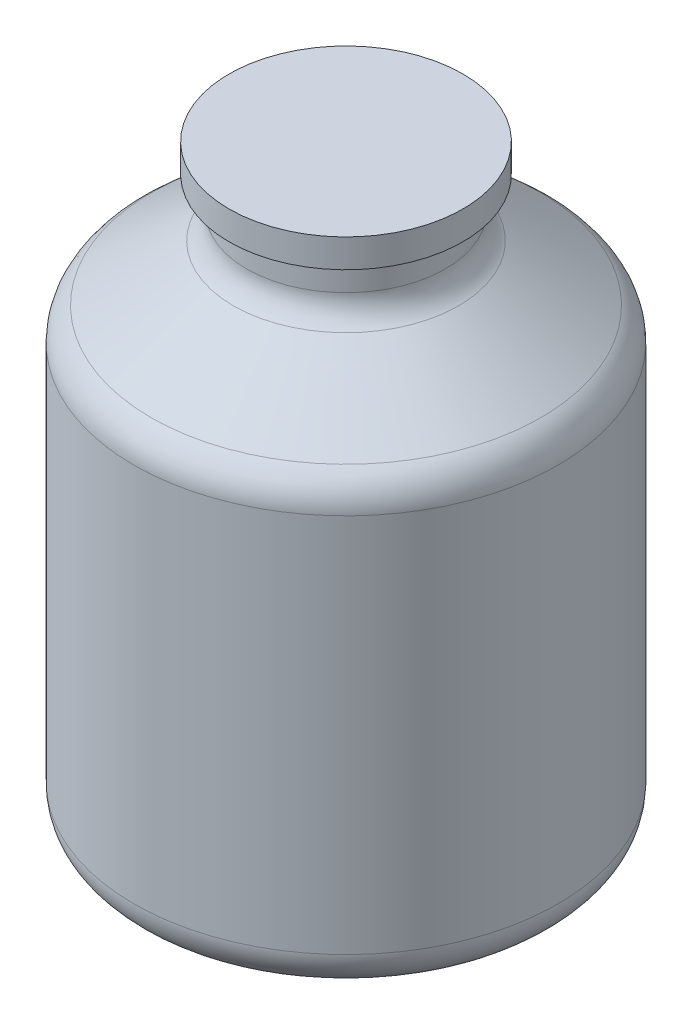
ISO-10303-21;
HEADER;
FILE_DESCRIPTION(('STEP AP214'),'2;1');
FILE_NAME('part.step','',(''),(''),'','','');
FILE_SCHEMA(('AUTOMOTIVE_DESIGN { 1 0 10303 214 1 1 1 1 }'));
ENDSEC;
DATA;
#1=APPLICATION_CONTEXT('core data for automotive mechanical design processes');
#2=APPLICATION_PROTOCOL_DEFINITION('international standard','automotive_design',2000,#1);
#3=PRODUCT_CONTEXT('',#1,'mechanical');
#4=PRODUCT('Part','Part','',(#3));
#5=PRODUCT_RELATED_PRODUCT_CATEGORY('part','',(#4));
#6=PRODUCT_DEFINITION_FORMATION('','',#4);
#7=PRODUCT_DEFINITION_CONTEXT('part definition',#1,'design');
#8=PRODUCT_DEFINITION('design','',#6,#7);
#9=PRODUCT_DEFINITION_SHAPE('','',#8);
#10=(LENGTH_UNIT() NAMED_UNIT(*) SI_UNIT(.MILLI.,.METRE.));
#11=(NAMED_UNIT(*) PLANE_ANGLE_UNIT() SI_UNIT($,.RADIAN.));
#12=(NAMED_UNIT(*) SI_UNIT($,.STERADIAN.) SOLID_ANGLE_UNIT());
#13=UNCERTAINTY_MEASURE_WITH_UNIT(LENGTH_MEASURE(1.E-05),#10,'distance_accuracy_value','');
#14=(GEOMETRIC_REPRESENTATION_CONTEXT(3) GLOBAL_UNCERTAINTY_ASSIGNED_CONTEXT((#13)) GLOBAL_UNIT_ASSIGNED_CONTEXT((#10,
#11,#12)) REPRESENTATION_CONTEXT('',''));
#15=CARTESIAN_POINT('',(0.,0.,0.));
#16=DIRECTION('',(0.,0.,1.));
#17=DIRECTION('',(1.,0.,0.));
#18=AXIS2_PLACEMENT_3D('',#15,#16,#17);
#19=CARTESIAN_POINT('',(0.,0.,0.));
#20=DIRECTION('',(0.,1.,0.));
#21=DIRECTION('',(0.,0.,1.));
#22=AXIS2_PLACEMENT_3D('',#19,#20,#21);
#23=PLANE('',#22);
#24=CARTESIAN_POINT('',(0.,0.,0.));
#25=DIRECTION('',(0.,1.,0.));
#26=DIRECTION('',(0.,0.,1.));
#27=AXIS2_PLACEMENT_3D('',#24,#25,#26);
#28=CIRCLE('',#27,55.8506106293866);
#29=CARTESIAN_POINT('',(0.,0.,55.8506106293866));
#30=VERTEX_POINT('',#29);
#31=EDGE_CURVE('E10',#30,#30,#28,.T.);
#32=ORIENTED_EDGE('',*,*,#31,.F.);
#33=EDGE_LOOP('',(#32));
#34=FACE_BOUND('',#33,.T.);
#35=ADVANCED_FACE('F32',(#34),#23,.F.);
#36=CARTESIAN_POINT('',(0.,12.7,0.));
#37=DIRECTION('',(0.,1.,0.));
#38=DIRECTION('',(0.,0.,1.));
#39=AXIS2_PLACEMENT_3D('',#36,#37,#38);
#40=TOROIDAL_SURFACE('',#39,55.8506106293866,12.7);
#41=CARTESIAN_POINT('',(0.,12.7,0.));
#42=DIRECTION('',(0.,1.,0.));
#43=DIRECTION('',(0.,0.,1.));
#44=AXIS2_PLACEMENT_3D('',#41,#42,#43);
#45=CIRCLE('',#44,68.5506106293866);
#46=CARTESIAN_POINT('',(0.,12.7,68.5506106293866));
#47=VERTEX_POINT('',#46);
#48=EDGE_CURVE('E38',#47,#47,#45,.T.);
#49=ORIENTED_EDGE('',*,*,#48,.F.);
#50=EDGE_LOOP('',(#49));
#51=FACE_BOUND('',#50,.T.);
#52=ORIENTED_EDGE('',*,*,#31,.T.);
#53=EDGE_LOOP('',(#52));
#54=FACE_BOUND('',#53,.T.);
#55=ADVANCED_FACE('F107',(#51,#54),#40,.T.);
#56=CARTESIAN_POINT('',(0.,191.88999199796,0.));
#57=DIRECTION('',(0.,1.,0.));
#58=DIRECTION('',(0.,0.,1.));
#59=AXIS2_PLACEMENT_3D('',#56,#57,#58);
#60=CYLINDRICAL_SURFACE('',#59,68.5506106293866);
#61=CARTESIAN_POINT('',(0.,135.537090780889,0.));
#62=DIRECTION('',(0.,1.,0.));
#63=DIRECTION('',(0.,0.,1.));
#64=AXIS2_PLACEMENT_3D('',#61,#62,#63);
#65=CIRCLE('',#64,68.5506106293866);
#66=CARTESIAN_POINT('',(0.,135.537090780889,68.5506106293866));
#67=VERTEX_POINT('',#66);
#68=EDGE_CURVE('E42',#67,#67,#65,.T.);
#69=ORIENTED_EDGE('',*,*,#68,.F.);
#70=EDGE_LOOP('',(#69));
#71=FACE_BOUND('',#70,.T.);
#72=ORIENTED_EDGE('',*,*,#48,.T.);
#73=EDGE_LOOP('',(#72));
#74=FACE_BOUND('',#73,.T.);
#75=ADVANCED_FACE('F102',(#71,#74),#60,.T.);
#76=CARTESIAN_POINT('',(0.,135.537090780889,0.));
#77=DIRECTION('',(0.,1.,0.));
#78=DIRECTION('',(0.,0.,1.));
#79=AXIS2_PLACEMENT_3D('',#76,#77,#78);
#80=TOROIDAL_SURFACE('',#79,55.8506106293866,12.7);
#81=CARTESIAN_POINT('',(0.,146.041145392436,0.));
#82=DIRECTION('',(0.,1.,0.));
#83=DIRECTION('',(0.,0.,1.));
#84=AXIS2_PLACEMENT_3D('',#81,#82,#83);
#85=CIRCLE('',#84,62.9888762953326);
#86=CARTESIAN_POINT('',(0.,146.041145392436,62.9888762953326));
#87=VERTEX_POINT('',#86);
#88=EDGE_CURVE('E46',#87,#87,#85,.T.);
#89=ORIENTED_EDGE('',*,*,#88,.F.);
#90=EDGE_LOOP('',(#89));
#91=FACE_BOUND('',#90,.T.);
#92=ORIENTED_EDGE('',*,*,#68,.T.);
#93=EDGE_LOOP('',(#92));
#94=FACE_BOUND('',#93,.T.);
#95=ADVANCED_FACE('F96',(#91,#94),#80,.T.);
#96=CARTESIAN_POINT('',(0.,146.041145392436,0.));
#97=DIRECTION('',(0.,-1.,0.));
#98=DIRECTION('',(0.,0.,-1.));
#99=AXIS2_PLACEMENT_3D('',#96,#97,#98);
#100=CONICAL_SURFACE('',#99,62.9888762953326,0.973912118745665);
#101=CARTESIAN_POINT('',(0.,164.092378592853,0.));
#102=DIRECTION('',(0.,1.,0.));
#103=DIRECTION('',(0.,0.,1.));
#104=AXIS2_PLACEMENT_3D('',#101,#102,#103);
#105=CIRCLE('',#104,36.4262421463226);
#106=CARTESIAN_POINT('',(0.,164.092378592853,36.4262421463226));
#107=VERTEX_POINT('',#106);
#108=EDGE_CURVE('E51',#107,#107,#105,.T.);
#109=ORIENTED_EDGE('',*,*,#108,.F.);
#110=EDGE_LOOP('',(#109));
#111=FACE_BOUND('',#110,.T.);
#112=ORIENTED_EDGE('',*,*,#88,.T.);
#113=EDGE_LOOP('',(#112));
#114=FACE_BOUND('',#113,.T.);
#115=ADVANCED_FACE('F90',(#111,#114),#100,.T.);
#116=CARTESIAN_POINT('',(0.,172.244930881121,0.));
#117=DIRECTION('',(0.,1.,0.));
#118=DIRECTION('',(0.,0.,1.));
#119=AXIS2_PLACEMENT_3D('',#116,#117,#118);
#120=TOROIDAL_SURFACE('',#119,41.9664917205388,9.85689982487104);
#121=CARTESIAN_POINT('',(0.,172.244930881121,0.));
#122=DIRECTION('',(0.,1.,0.));
#123=DIRECTION('',(0.,0.,1.));
#124=AXIS2_PLACEMENT_3D('',#121,#122,#123);
#125=CIRCLE('',#124,32.1095918956678);
#126=CARTESIAN_POINT('',(0.,172.244930881121,32.1095918956678));
#127=VERTEX_POINT('',#126);
#128=EDGE_CURVE('E54',#127,#127,#125,.T.);
#129=ORIENTED_EDGE('',*,*,#128,.F.);
#130=EDGE_LOOP('',(#129));
#131=FACE_BOUND('',#130,.T.);
#132=ORIENTED_EDGE('',*,*,#108,.T.);
#133=EDGE_LOOP('',(#132));
#134=FACE_BOUND('',#133,.T.);
#135=ADVANCED_FACE('F84',(#131,#134),#120,.F.);
#136=CARTESIAN_POINT('',(0.,191.88999199796,0.));
#137=DIRECTION('',(0.,1.,0.));
#138=DIRECTION('',(0.,0.,1.));
#139=AXIS2_PLACEMENT_3D('',#136,#137,#138);
#140=CYLINDRICAL_SURFACE('',#139,32.1095918956678);
#141=CARTESIAN_POINT('',(0.,182.693006016334,0.));
#142=DIRECTION('',(0.,1.,0.));
#143=DIRECTION('',(0.,0.,1.));
#144=AXIS2_PLACEMENT_3D('',#141,#142,#143);
#145=CIRCLE('',#144,32.1095918956678);
#146=CARTESIAN_POINT('',(0.,182.693006016334,32.1095918956678));
#147=VERTEX_POINT('',#146);
#148=EDGE_CURVE('E57',#147,#147,#145,.T.);
#149=ORIENTED_EDGE('',*,*,#148,.F.);
#150=EDGE_LOOP('',(#149));
#151=FACE_BOUND('',#150,.T.);
#152=ORIENTED_EDGE('',*,*,#128,.T.);
#153=EDGE_LOOP('',(#152));
#154=FACE_BOUND('',#153,.T.);
#155=ADVANCED_FACE('F78',(#151,#154),#140,.T.);
#156=CARTESIAN_POINT('',(32.1095918956678,182.693006016334,0.));
#157=DIRECTION('',(0.,1.,0.));
#158=DIRECTION('',(0.,0.,1.));
#159=AXIS2_PLACEMENT_3D('',#156,#157,#158);
#160=PLANE('',#159);
#161=CARTESIAN_POINT('',(0.,182.693006016334,0.));
#162=DIRECTION('',(0.,1.,0.));
#163=DIRECTION('',(0.,0.,1.));
#164=AXIS2_PLACEMENT_3D('',#161,#162,#163);
#165=CIRCLE('',#164,37.8125387824389);
#166=CARTESIAN_POINT('',(0.,182.693006016334,37.8125387824389));
#167=VERTEX_POINT('',#166);
#168=EDGE_CURVE('E60',#167,#167,#165,.T.);
#169=ORIENTED_EDGE('',*,*,#168,.F.);
#170=EDGE_LOOP('',(#169));
#171=FACE_BOUND('',#170,.T.);
#172=ORIENTED_EDGE('',*,*,#148,.T.);
#173=EDGE_LOOP('',(#172));
#174=FACE_BOUND('',#173,.T.);
#175=ADVANCED_FACE('F72',(#171,#174),#160,.F.);
#176=CARTESIAN_POINT('',(0.,191.88999199796,0.));
#177=DIRECTION('',(0.,1.,0.));
#178=DIRECTION('',(0.,0.,1.));
#179=AXIS2_PLACEMENT_3D('',#176,#177,#178);
#180=CYLINDRICAL_SURFACE('',#179,37.8125387824389);
#181=CARTESIAN_POINT('',(0.,191.88999199796,0.));
#182=DIRECTION('',(0.,1.,0.));
#183=DIRECTION('',(0.,0.,1.));
#184=AXIS2_PLACEMENT_3D('',#181,#182,#183);
#185=CIRCLE('',#184,37.8125387824389);
#186=CARTESIAN_POINT('',(0.,191.88999199796,37.8125387824389));
#187=VERTEX_POINT('',#186);
#188=EDGE_CURVE('E63',#187,#187,#185,.T.);
#189=ORIENTED_EDGE('',*,*,#188,.F.);
#190=EDGE_LOOP('',(#189));
#191=FACE_BOUND('',#190,.T.);
#192=ORIENTED_EDGE('',*,*,#168,.T.);
#193=EDGE_LOOP('',(#192));
#194=FACE_BOUND('',#193,.T.);
#195=ADVANCED_FACE('F69',(#191,#194),#180,.T.);
#196=CARTESIAN_POINT('',(37.8125387824389,191.88999199796,0.));
#197=DIRECTION('',(0.,-1.,0.));
#198=DIRECTION('',(0.,0.,-1.));
#199=AXIS2_PLACEMENT_3D('',#196,#197,#198);
#200=PLANE('',#199);
#201=ORIENTED_EDGE('',*,*,#188,.T.);
#202=EDGE_LOOP('',(#201));
#203=FACE_BOUND('',#202,.T.);
#204=ADVANCED_FACE('F67',(#203),#200,.F.);
#205=CLOSED_SHELL('',(#35,#55,#75,#95,#115,#135,#155,#175,#195,#204));
#206=MANIFOLD_SOLID_BREP('B2',#205);
#207=ADVANCED_BREP_SHAPE_REPRESENTATION('',(#18,#206),#14);
#208=SHAPE_DEFINITION_REPRESENTATION(#9,#207);
ENDSEC;
END-ISO-10303-21;
